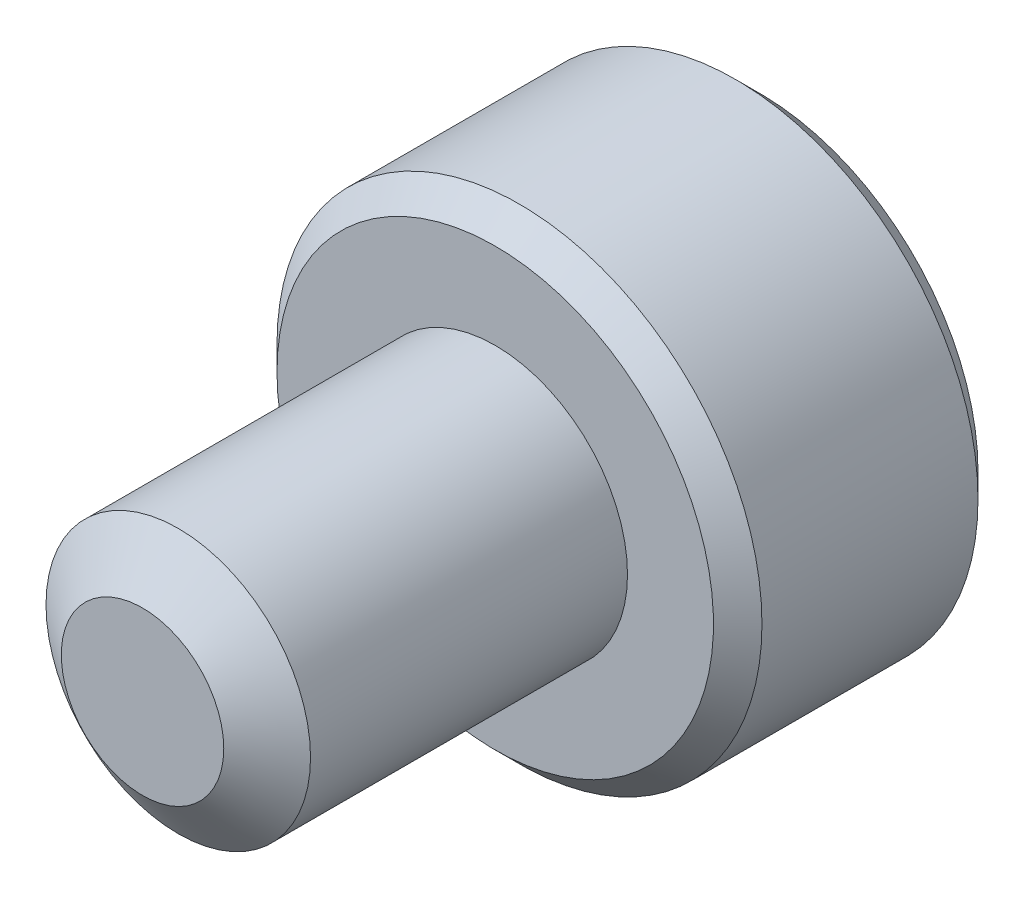
ISO-10303-21;
HEADER;
FILE_DESCRIPTION(('STEP AP214'),'2;1');
FILE_NAME('part.step','',(''),(''),'','','');
FILE_SCHEMA(('AUTOMOTIVE_DESIGN { 1 0 10303 214 1 1 1 1 }'));
ENDSEC;
DATA;
#1=APPLICATION_CONTEXT('core data for automotive mechanical design processes');
#2=APPLICATION_PROTOCOL_DEFINITION('international standard','automotive_design',2000,#1);
#3=PRODUCT_CONTEXT('',#1,'mechanical');
#4=PRODUCT('Part','Part','',(#3));
#5=PRODUCT_RELATED_PRODUCT_CATEGORY('part','',(#4));
#6=PRODUCT_DEFINITION_FORMATION('','',#4);
#7=PRODUCT_DEFINITION_CONTEXT('part definition',#1,'design');
#8=PRODUCT_DEFINITION('design','',#6,#7);
#9=PRODUCT_DEFINITION_SHAPE('','',#8);
#10=(LENGTH_UNIT() NAMED_UNIT(*) SI_UNIT(.MILLI.,.METRE.));
#11=(NAMED_UNIT(*) PLANE_ANGLE_UNIT() SI_UNIT($,.RADIAN.));
#12=(NAMED_UNIT(*) SI_UNIT($,.STERADIAN.) SOLID_ANGLE_UNIT());
#13=UNCERTAINTY_MEASURE_WITH_UNIT(LENGTH_MEASURE(1.E-05),#10,'distance_accuracy_value','');
#14=(GEOMETRIC_REPRESENTATION_CONTEXT(3) GLOBAL_UNCERTAINTY_ASSIGNED_CONTEXT((#13)) GLOBAL_UNIT_ASSIGNED_CONTEXT((#10,
#11,#12)) REPRESENTATION_CONTEXT('',''));
#15=CARTESIAN_POINT('',(0.,0.,0.));
#16=DIRECTION('',(0.,0.,1.));
#17=DIRECTION('',(1.,0.,0.));
#18=AXIS2_PLACEMENT_3D('',#15,#16,#17);
#19=CARTESIAN_POINT('',(0.,0.,-4.));
#20=DIRECTION('',(0.,0.,1.));
#21=DIRECTION('',(1.,0.,0.));
#22=AXIS2_PLACEMENT_3D('',#19,#20,#21);
#23=CYLINDRICAL_SURFACE('',#22,1.5);
#24=CARTESIAN_POINT('',(0.,0.,-4.));
#25=DIRECTION('',(0.,0.,-1.));
#26=DIRECTION('',(-1.,0.,0.));
#27=AXIS2_PLACEMENT_3D('',#24,#25,#26);
#28=CIRCLE('',#27,1.5);
#29=CARTESIAN_POINT('',(-1.5,0.,-4.));
#30=VERTEX_POINT('',#29);
#31=EDGE_CURVE('E218',#30,#30,#28,.F.);
#32=ORIENTED_EDGE('',*,*,#31,.T.);
#33=EDGE_LOOP('',(#32));
#34=FACE_BOUND('',#33,.T.);
#35=CARTESIAN_POINT('',(0.,0.,-0.40525178320938));
#36=DIRECTION('',(0.,0.,1.));
#37=DIRECTION('',(1.,0.,0.));
#38=AXIS2_PLACEMENT_3D('',#35,#36,#37);
#39=CIRCLE('',#38,1.5);
#40=CARTESIAN_POINT('',(1.5,0.,-0.40525178320938));
#41=VERTEX_POINT('',#40);
#42=EDGE_CURVE('E112',#41,#41,#39,.T.);
#43=ORIENTED_EDGE('',*,*,#42,.F.);
#44=EDGE_LOOP('',(#43));
#45=FACE_BOUND('',#44,.T.);
#46=ADVANCED_FACE('F38',(#34,#45),#23,.T.);
#47=CARTESIAN_POINT('',(0.,0.,0.));
#48=DIRECTION('',(0.,0.,-1.));
#49=DIRECTION('',(-1.,0.,0.));
#50=AXIS2_PLACEMENT_3D('',#47,#48,#49);
#51=CONICAL_SURFACE('',#50,0.921240473580834,0.959931088596884);
#52=ORIENTED_EDGE('',*,*,#42,.T.);
#53=EDGE_LOOP('',(#52));
#54=FACE_BOUND('',#53,.T.);
#55=CARTESIAN_POINT('',(0.,0.,0.));
#56=DIRECTION('',(0.,0.,1.));
#57=DIRECTION('',(1.,0.,0.));
#58=AXIS2_PLACEMENT_3D('',#55,#56,#57);
#59=CIRCLE('',#58,0.921240473580834);
#60=CARTESIAN_POINT('',(0.921240473580834,0.,0.));
#61=VERTEX_POINT('',#60);
#62=EDGE_CURVE('E216',#61,#61,#59,.T.);
#63=ORIENTED_EDGE('',*,*,#62,.F.);
#64=EDGE_LOOP('',(#63));
#65=FACE_BOUND('',#64,.T.);
#66=ADVANCED_FACE('F199',(#54,#65),#51,.T.);
#67=CARTESIAN_POINT('',(0.,0.,0.));
#68=DIRECTION('',(0.,0.,1.));
#69=DIRECTION('',(1.,0.,0.));
#70=AXIS2_PLACEMENT_3D('',#67,#68,#69);
#71=PLANE('',#70);
#72=ORIENTED_EDGE('',*,*,#62,.T.);
#73=EDGE_LOOP('',(#72));
#74=FACE_BOUND('',#73,.T.);
#75=ADVANCED_FACE('F196',(#74),#71,.T.);
#76=CARTESIAN_POINT('',(0.,0.,-7.));
#77=DIRECTION('',(0.,0.,1.));
#78=DIRECTION('',(1.,0.,0.));
#79=AXIS2_PLACEMENT_3D('',#76,#77,#78);
#80=CYLINDRICAL_SURFACE('',#79,2.75);
#81=CARTESIAN_POINT('',(0.,0.,-6.725));
#82=DIRECTION('',(0.,0.,-1.));
#83=DIRECTION('',(-1.,0.,0.));
#84=AXIS2_PLACEMENT_3D('',#81,#82,#83);
#85=CIRCLE('',#84,2.75);
#86=CARTESIAN_POINT('',(2.75,0.,-6.725));
#87=VERTEX_POINT('',#86);
#88=EDGE_CURVE('E46',#87,#87,#85,.F.);
#89=ORIENTED_EDGE('',*,*,#88,.T.);
#90=EDGE_LOOP('',(#89));
#91=FACE_BOUND('',#90,.T.);
#92=CARTESIAN_POINT('',(0.,0.,-4.275));
#93=DIRECTION('',(0.,0.,-1.));
#94=DIRECTION('',(-1.,0.,0.));
#95=AXIS2_PLACEMENT_3D('',#92,#93,#94);
#96=CIRCLE('',#95,2.75);
#97=CARTESIAN_POINT('',(-2.75,0.,-4.275));
#98=VERTEX_POINT('',#97);
#99=EDGE_CURVE('E175',#98,#98,#96,.T.);
#100=ORIENTED_EDGE('',*,*,#99,.T.);
#101=EDGE_LOOP('',(#100));
#102=FACE_BOUND('',#101,.T.);
#103=ADVANCED_FACE('F180',(#91,#102),#80,.T.);
#104=CARTESIAN_POINT('',(0.,0.,-7.));
#105=DIRECTION('',(0.,0.,-1.));
#106=DIRECTION('',(-1.,0.,0.));
#107=AXIS2_PLACEMENT_3D('',#104,#105,#106);
#108=PLANE('',#107);
#109=CARTESIAN_POINT('',(0.,0.,-7.));
#110=DIRECTION('',(0.,0.,-1.));
#111=DIRECTION('',(-1.,0.,0.));
#112=AXIS2_PLACEMENT_3D('',#109,#110,#111);
#113=CIRCLE('',#112,2.475);
#114=CARTESIAN_POINT('',(2.475,0.,-7.));
#115=VERTEX_POINT('',#114);
#116=EDGE_CURVE('E111',#115,#115,#113,.T.);
#117=ORIENTED_EDGE('',*,*,#116,.T.);
#118=EDGE_LOOP('',(#117));
#119=FACE_BOUND('',#118,.T.);
#120=CARTESIAN_POINT('',(0.,0.,-7.));
#121=DIRECTION('',(0.,0.,-1.));
#122=DIRECTION('',(-1.,0.,0.));
#123=AXIS2_PLACEMENT_3D('',#120,#121,#122);
#124=CIRCLE('',#123,1.44337567297406);
#125=CARTESIAN_POINT('',(-1.25,0.721687836487031,-7.));
#126=VERTEX_POINT('',#125);
#127=CARTESIAN_POINT('',(0.,1.44337567297406,-7.));
#128=VERTEX_POINT('',#127);
#129=EDGE_CURVE('E92',#126,#128,#124,.T.);
#130=ORIENTED_EDGE('',*,*,#129,.F.);
#131=CARTESIAN_POINT('',(-1.25,-0.721687836487032,-7.));
#132=VERTEX_POINT('',#131);
#133=EDGE_CURVE('E52',#132,#126,#124,.T.);
#134=ORIENTED_EDGE('',*,*,#133,.F.);
#135=CARTESIAN_POINT('',(0.,-1.44337567297406,-7.));
#136=VERTEX_POINT('',#135);
#137=EDGE_CURVE('E277',#136,#132,#124,.T.);
#138=ORIENTED_EDGE('',*,*,#137,.F.);
#139=CARTESIAN_POINT('',(1.25,-0.721687836487032,-7.));
#140=VERTEX_POINT('',#139);
#141=EDGE_CURVE('E59',#140,#136,#124,.T.);
#142=ORIENTED_EDGE('',*,*,#141,.F.);
#143=CARTESIAN_POINT('',(1.25,0.721687836487033,-7.));
#144=VERTEX_POINT('',#143);
#145=EDGE_CURVE('E133',#144,#140,#124,.T.);
#146=ORIENTED_EDGE('',*,*,#145,.F.);
#147=EDGE_CURVE('E101',#128,#144,#124,.T.);
#148=ORIENTED_EDGE('',*,*,#147,.F.);
#149=EDGE_LOOP('',(#130,#134,#138,#142,#146,#148));
#150=FACE_BOUND('',#149,.T.);
#151=ADVANCED_FACE('F132',(#119,#150),#108,.T.);
#152=CARTESIAN_POINT('',(0.,0.,-4.));
#153=DIRECTION('',(0.,0.,-1.));
#154=DIRECTION('',(-1.,0.,0.));
#155=AXIS2_PLACEMENT_3D('',#152,#153,#154);
#156=PLANE('',#155);
#157=CARTESIAN_POINT('',(0.,0.,-4.));
#158=DIRECTION('',(0.,0.,-1.));
#159=DIRECTION('',(-1.,0.,0.));
#160=AXIS2_PLACEMENT_3D('',#157,#158,#159);
#161=CIRCLE('',#160,2.475);
#162=CARTESIAN_POINT('',(-2.475,0.,-4.));
#163=VERTEX_POINT('',#162);
#164=EDGE_CURVE('E11',#163,#163,#161,.F.);
#165=ORIENTED_EDGE('',*,*,#164,.T.);
#166=EDGE_LOOP('',(#165));
#167=FACE_BOUND('',#166,.T.);
#168=ORIENTED_EDGE('',*,*,#31,.F.);
#169=EDGE_LOOP('',(#168));
#170=FACE_BOUND('',#169,.T.);
#171=ADVANCED_FACE('F189',(#167,#170),#156,.F.);
#172=CARTESIAN_POINT('',(0.,0.,-7.));
#173=DIRECTION('',(0.,0.,-1.));
#174=DIRECTION('',(-1.,0.,0.));
#175=AXIS2_PLACEMENT_3D('',#172,#173,#174);
#176=CONICAL_SURFACE('',#175,1.44337567297406,0.78539816339745);
#177=ORIENTED_EDGE('',*,*,#147,.T.);
#178=CARTESIAN_POINT('',(-0.000199999999999818,1.4434911430279,-7.00011548390914));
#179=CARTESIAN_POINT('',(0.0427751670715868,1.41867941875065,-6.9753216680551));
#180=CARTESIAN_POINT('',(0.0864690047459481,1.39345276980743,-6.95198373441868));
#181=CARTESIAN_POINT('',(0.175565930841942,1.34201263554194,-6.90925200408454));
#182=CARTESIAN_POINT('',(0.220977498357064,1.31579425481276,-6.88988199236041));
#183=CARTESIAN_POINT('',(0.31254782093526,1.26292610442246,-6.85670048341348));
#184=CARTESIAN_POINT('',(0.358683240175886,1.23628980770471,-6.84280555905266));
#185=CARTESIAN_POINT('',(0.451970080407593,1.18243062538508,-6.82139728216064));
#186=CARTESIAN_POINT('',(0.49911864913638,1.15520938653761,-6.81386794156679));
#187=CARTESIAN_POINT('',(0.580373556887253,1.10829684367467,-6.8070744980507));
#188=CARTESIAN_POINT('',(0.614374876627942,1.08866617256958,-6.80606855910435));
#189=CARTESIAN_POINT('',(0.682317764432478,1.04943932800611,-6.80776141491132));
#190=CARTESIAN_POINT('',(0.716259317655658,1.02984316311599,-6.81046102721554));
#191=CARTESIAN_POINT('',(0.7838148564575,0.990839954603499,-6.81940893031638));
#192=CARTESIAN_POINT('',(0.817428507286775,0.971433104248771,-6.82566052589971));
#193=CARTESIAN_POINT('',(0.884094638217814,0.932943395609905,-6.84137568141391));
#194=CARTESIAN_POINT('',(0.917146871030296,0.9138606800983,-6.85084062008746));
#195=CARTESIAN_POINT('',(1.00179969160027,0.864986351354567,-6.87893139068759));
#196=CARTESIAN_POINT('',(1.05286649242964,0.835502920149075,-6.8996701574522));
#197=CARTESIAN_POINT('',(1.15300085411326,0.777690319475908,-6.94638713467148));
#198=CARTESIAN_POINT('',(1.20207431157827,0.749357745598416,-6.97234829594677));
#199=CARTESIAN_POINT('',(1.2502,0.721572366433194,-7.00011548390914));
#200=B_SPLINE_CURVE_WITH_KNOTS('',3,(#178,#179,#180,#181,#182,#183,#184,#185,#186,#187,#188,
#189,#190,#191,#192,#193,#194,#195,#196,#197,#198,#199),.UNSPECIFIED.,.F.,.F.,(4,2,2,2,2,2,2,2,
2,2,4),(0.,0.166533409618303,0.334037607289762,0.498880396489699,0.663307919240275,
0.780963963458827,0.898645970148454,1.01643764860773,1.1342799317155,1.32148652032141,
1.50809158792574),.UNSPECIFIED.);
#201=EDGE_CURVE('E106',#128,#144,#200,.T.);
#202=ORIENTED_EDGE('',*,*,#201,.F.);
#203=EDGE_LOOP('',(#177,#202));
#204=FACE_BOUND('',#203,.T.);
#205=ADVANCED_FACE('F107',(#204),#176,.F.);
#206=ORIENTED_EDGE('',*,*,#145,.T.);
#207=CARTESIAN_POINT('',(1.25,-1.43934010808077,-7.46298209689233));
#208=CARTESIAN_POINT('',(1.25,-1.40429313005659,-7.43652492263289));
#209=CARTESIAN_POINT('',(1.25,-1.36905087135599,-7.41032716035428));
#210=CARTESIAN_POINT('',(1.25,-1.29809650706311,-7.35855757183958));
#211=CARTESIAN_POINT('',(1.25,-1.26238428576495,-7.33298590435629));
#212=CARTESIAN_POINT('',(1.25,-1.15390111792708,-7.25700599368946));
#213=CARTESIAN_POINT('',(1.25,-1.08031646726264,-7.20774028618957));
#214=CARTESIAN_POINT('',(1.25,-0.926012322755096,-7.11102583026313));
#215=CARTESIAN_POINT('',(1.25,-0.845125318656147,-7.0638412989418));
#216=CARTESIAN_POINT('',(1.25,-0.679311174076602,-6.97753073439041));
#217=CARTESIAN_POINT('',(1.25,-0.594398891026688,-6.9383775346269));
#218=CARTESIAN_POINT('',(1.25,-0.466944812460741,-6.89047722368829));
#219=CARTESIAN_POINT('',(1.25,-0.426289985812822,-6.87672948978634));
#220=CARTESIAN_POINT('',(1.25,-0.343998850091268,-6.85249792745054));
#221=CARTESIAN_POINT('',(1.25,-0.302362473614963,-6.84201432386977));
#222=CARTESIAN_POINT('',(1.25,-0.219052696285666,-6.8250301617483));
#223=CARTESIAN_POINT('',(1.25,-0.177393428474501,-6.81846136047137));
#224=CARTESIAN_POINT('',(1.25,-0.0936293693401928,-6.80943505345776));
#225=CARTESIAN_POINT('',(1.25,-0.0515246558543966,-6.80697684099727));
#226=CARTESIAN_POINT('',(1.25,0.0311890576306311,-6.80635406201329));
#227=CARTESIAN_POINT('',(1.25,0.07179696254993,-6.80803711684625));
#228=CARTESIAN_POINT('',(1.25,0.152668636885197,-6.81526827059791));
#229=CARTESIAN_POINT('',(1.25,0.192932338835358,-6.82081711041311));
#230=CARTESIAN_POINT('',(1.25,0.273499879165295,-6.83557103646495));
#231=CARTESIAN_POINT('',(1.25,0.313792180618511,-6.84483817596411));
#232=CARTESIAN_POINT('',(1.25,0.393496413911457,-6.86653617845735));
#233=CARTESIAN_POINT('',(1.25,0.432908419115059,-6.87896677673065));
#234=CARTESIAN_POINT('',(1.25,0.556992735862298,-6.92277935293144));
#235=CARTESIAN_POINT('',(1.25,0.639898924666085,-6.95915107287596));
#236=CARTESIAN_POINT('',(1.25,0.801816555499701,-7.04001916217833));
#237=CARTESIAN_POINT('',(1.25,0.880812666325044,-7.08454472091199));
#238=CARTESIAN_POINT('',(1.25,1.0317856127975,-7.17640487666662));
#239=CARTESIAN_POINT('',(1.25,1.10391618485086,-7.22348993391625));
#240=CARTESIAN_POINT('',(1.25,1.2101860604331,-7.29627856159854));
#241=CARTESIAN_POINT('',(1.25,1.24515069969379,-7.32079808539336));
#242=CARTESIAN_POINT('',(1.25,1.31460220852736,-7.37048563676568));
#243=CARTESIAN_POINT('',(1.25,1.34908920596618,-7.39565348541552));
#244=CARTESIAN_POINT('',(1.25,1.38337731682911,-7.42109014884121));
#245=B_SPLINE_CURVE_WITH_KNOTS('',3,(#207,#208,#209,#210,#211,#212,#213,#214,#215,#216,#217,
#218,#219,#220,#221,#222,#223,#224,#225,#226,#227,#228,#229,#230,#231,#232,#233,#234,#235,#236,
#237,#238,#239,#240,#241,#242,#243,#244),.UNSPECIFIED.,.F.,.F.,(4,2,2,2,2,2,2,2,2,2,2,2,2,2,2,2,
2,2,4),(0.,0.131732960381448,0.263498984161645,0.529042014455826,0.809741926134619,
1.08947609717225,1.21811634272577,1.346765447839,1.47310084517844,1.59941451973784,
1.72115042167849,1.84290966131735,1.96679153905342,2.09066305366039,2.36146692896009,
2.63325989198491,2.89154668212279,3.01965734507713,3.14773302245628),.UNSPECIFIED.);
#246=EDGE_CURVE('E100',#144,#140,#245,.F.);
#247=ORIENTED_EDGE('',*,*,#246,.F.);
#248=EDGE_LOOP('',(#206,#247));
#249=FACE_BOUND('',#248,.T.);
#250=ADVANCED_FACE('F283',(#249),#176,.F.);
#251=ORIENTED_EDGE('',*,*,#141,.T.);
#252=CARTESIAN_POINT('',(1.2502,-0.721572366433195,-7.00011548390914));
#253=CARTESIAN_POINT('',(1.20722483292841,-0.746384090710444,-6.9753216680551));
#254=CARTESIAN_POINT('',(1.16353099525405,-0.771610739653665,-6.95198373441869));
#255=CARTESIAN_POINT('',(1.07443406915806,-0.823050873919155,-6.90925200408454));
#256=CARTESIAN_POINT('',(1.02902250164294,-0.849269254648333,-6.88988199236042));
#257=CARTESIAN_POINT('',(0.937452179064741,-0.902137405038636,-6.85670048341348));
#258=CARTESIAN_POINT('',(0.891316759824115,-0.928773701756387,-6.84280555905266));
#259=CARTESIAN_POINT('',(0.798029919592408,-0.982632884076013,-6.82139728216064));
#260=CARTESIAN_POINT('',(0.75088135086362,-1.00985412292348,-6.81386794156679));
#261=CARTESIAN_POINT('',(0.669626443112748,-1.05676666578643,-6.8070744980507));
#262=CARTESIAN_POINT('',(0.635625123372059,-1.07639733689152,-6.80606855910435));
#263=CARTESIAN_POINT('',(0.567682235567523,-1.11562418145499,-6.80776141491132));
#264=CARTESIAN_POINT('',(0.533740682344343,-1.1352203463451,-6.81046102721554));
#265=CARTESIAN_POINT('',(0.466185143542501,-1.1742235548576,-6.81940893031638));
#266=CARTESIAN_POINT('',(0.432571492713225,-1.19363040521233,-6.82566052589971));
#267=CARTESIAN_POINT('',(0.365905361782187,-1.23212011385119,-6.84137568141391));
#268=CARTESIAN_POINT('',(0.332853128969705,-1.2512028293628,-6.85084062008746));
#269=CARTESIAN_POINT('',(0.248200308399736,-1.30007715810653,-6.87893139068759));
#270=CARTESIAN_POINT('',(0.197133507570362,-1.32956058931202,-6.8996701574522));
#271=CARTESIAN_POINT('',(0.0969991458867453,-1.38737318998519,-6.94638713467148));
#272=CARTESIAN_POINT('',(0.0479256884217306,-1.41570576386268,-6.97234829594677));
#273=CARTESIAN_POINT('',(-0.000199999999999859,-1.4434911430279,-7.00011548390914));
#274=B_SPLINE_CURVE_WITH_KNOTS('',3,(#252,#253,#254,#255,#256,#257,#258,#259,#260,#261,#262,
#263,#264,#265,#266,#267,#268,#269,#270,#271,#272,#273),.UNSPECIFIED.,.F.,.F.,(4,2,2,2,2,2,2,2,
2,2,4),(0.,0.166533409618303,0.334037607289761,0.498880396489698,0.663307919240274,
0.780963963458826,0.898645970148453,1.01643764860773,1.13427993171549,1.32148652032141,
1.50809158792573),.UNSPECIFIED.);
#275=EDGE_CURVE('E143',#140,#136,#274,.T.);
#276=ORIENTED_EDGE('',*,*,#275,.F.);
#277=EDGE_LOOP('',(#251,#276));
#278=FACE_BOUND('',#277,.T.);
#279=ADVANCED_FACE('F280',(#278),#176,.F.);
#280=ORIENTED_EDGE('',*,*,#137,.T.);
#281=CARTESIAN_POINT('',(0.000200000000000015,-1.4434911430279,-7.00011548390914));
#282=CARTESIAN_POINT('',(-0.0427751670715867,-1.41867941875065,-6.9753216680551));
#283=CARTESIAN_POINT('',(-0.086469004745948,-1.39345276980743,-6.95198373441868));
#284=CARTESIAN_POINT('',(-0.175565930841942,-1.34201263554194,-6.90925200408454));
#285=CARTESIAN_POINT('',(-0.220977498357064,-1.31579425481276,-6.88988199236041));
#286=CARTESIAN_POINT('',(-0.312547820935259,-1.26292610442246,-6.85670048341348));
#287=CARTESIAN_POINT('',(-0.358683240175885,-1.23628980770471,-6.84280555905266));
#288=CARTESIAN_POINT('',(-0.451970080407592,-1.18243062538508,-6.82139728216064));
#289=CARTESIAN_POINT('',(-0.499118649136379,-1.15520938653761,-6.81386794156679));
#290=CARTESIAN_POINT('',(-0.580373556887252,-1.10829684367467,-6.8070744980507));
#291=CARTESIAN_POINT('',(-0.61437487662794,-1.08866617256958,-6.80606855910435));
#292=CARTESIAN_POINT('',(-0.682317764432477,-1.04943932800611,-6.80776141491132));
#293=CARTESIAN_POINT('',(-0.716259317655657,-1.02984316311599,-6.81046102721554));
#294=CARTESIAN_POINT('',(-0.783814856457499,-0.9908399546035,-6.81940893031638));
#295=CARTESIAN_POINT('',(-0.817428507286774,-0.971433104248772,-6.82566052589971));
#296=CARTESIAN_POINT('',(-0.884094638217813,-0.932943395609906,-6.84137568141391));
#297=CARTESIAN_POINT('',(-0.917146871030295,-0.913860680098301,-6.85084062008746));
#298=CARTESIAN_POINT('',(-1.00179969160026,-0.864986351354568,-6.87893139068759));
#299=CARTESIAN_POINT('',(-1.05286649242964,-0.835502920149076,-6.8996701574522));
#300=CARTESIAN_POINT('',(-1.15300085411326,-0.777690319475909,-6.94638713467148));
#301=CARTESIAN_POINT('',(-1.20207431157827,-0.749357745598417,-6.97234829594677));
#302=CARTESIAN_POINT('',(-1.2502,-0.721572366433195,-7.00011548390914));
#303=B_SPLINE_CURVE_WITH_KNOTS('',3,(#281,#282,#283,#284,#285,#286,#287,#288,#289,#290,#291,
#292,#293,#294,#295,#296,#297,#298,#299,#300,#301,#302),.UNSPECIFIED.,.F.,.F.,(4,2,2,2,2,2,2,2,
2,2,4),(0.,0.166533409618304,0.334037607289761,0.498880396489697,0.663307919240274,
0.780963963458826,0.898645970148452,1.01643764860773,1.13427993171549,1.32148652032141,
1.50809158792574),.UNSPECIFIED.);
#304=EDGE_CURVE('E254',#136,#132,#303,.T.);
#305=ORIENTED_EDGE('',*,*,#304,.F.);
#306=EDGE_LOOP('',(#280,#305));
#307=FACE_BOUND('',#306,.T.);
#308=ADVANCED_FACE('F279',(#307),#176,.F.);
#309=ORIENTED_EDGE('',*,*,#133,.T.);
#310=CARTESIAN_POINT('',(-1.25,-1.43934010829019,-7.46298209705044));
#311=CARTESIAN_POINT('',(-1.25,-1.40429313026013,-7.43652492278491));
#312=CARTESIAN_POINT('',(-1.25,-1.36905087155364,-7.41032716050022));
#313=CARTESIAN_POINT('',(-1.25,-1.29809650724891,-7.3585575719734));
#314=CARTESIAN_POINT('',(-1.25,-1.2623842859448,-7.33298590448407));
#315=CARTESIAN_POINT('',(-1.25,-1.1539011180887,-7.25700599379899));
#316=CARTESIAN_POINT('',(-1.25,-1.08031646741188,-7.20774028628697));
#317=CARTESIAN_POINT('',(-1.25,-0.926012322877303,-7.11102583033562));
#318=CARTESIAN_POINT('',(-1.25,-0.845125318763649,-7.06384129900157));
#319=CARTESIAN_POINT('',(-1.25,-0.679311174153444,-6.97753073442662));
#320=CARTESIAN_POINT('',(-1.25,-0.594398891087584,-6.93837753465223));
#321=CARTESIAN_POINT('',(-1.25,-0.466944812509639,-6.89047722370555));
#322=CARTESIAN_POINT('',(-1.25,-0.426289985866744,-6.87672948980391));
#323=CARTESIAN_POINT('',(-1.25,-0.343998850155403,-6.85249792746773));
#324=CARTESIAN_POINT('',(-1.25,-0.302362473684286,-6.84201432388626));
#325=CARTESIAN_POINT('',(-1.25,-0.219052696365195,-6.8250301617622));
#326=CARTESIAN_POINT('',(-1.25,-0.177393428559044,-6.81846136048343));
#327=CARTESIAN_POINT('',(-1.25,-0.0936293694345983,-6.80943505346499));
#328=CARTESIAN_POINT('',(-1.25,-0.0515246559536491,-6.80697684100152));
#329=CARTESIAN_POINT('',(-1.25,0.0311890575224384,-6.80635406201073));
#330=CARTESIAN_POINT('',(-1.25,0.0717969624376317,-6.80803711683992));
#331=CARTESIAN_POINT('',(-1.25,0.152668636765093,-6.81526827058346));
#332=CARTESIAN_POINT('',(-1.25,0.192932338711553,-6.8208171103943));
#333=CARTESIAN_POINT('',(-1.25,0.273499879034189,-6.83557103643701));
#334=CARTESIAN_POINT('',(-1.25,0.313792180483814,-6.84483817593136));
#335=CARTESIAN_POINT('',(-1.25,0.393496413769926,-6.86653617841489));
#336=CARTESIAN_POINT('',(-1.25,0.432908418970283,-6.87896677668328));
#337=CARTESIAN_POINT('',(-1.25,0.556992735685998,-6.92277935286094));
#338=CARTESIAN_POINT('',(-1.25,0.639898924463084,-6.95915107278417));
#339=CARTESIAN_POINT('',(-1.25,0.801816555245349,-7.04001916204164));
#340=CARTESIAN_POINT('',(-1.25,0.880812666046054,-7.08454472075164));
#341=CARTESIAN_POINT('',(-1.25,1.03178561247421,-7.17640487646102));
#342=CARTESIAN_POINT('',(-1.25,1.10391618450775,-7.22348993368924));
#343=CARTESIAN_POINT('',(-1.25,1.2101860600607,-7.29627856133953));
#344=CARTESIAN_POINT('',(-1.25,1.24515069931176,-7.32079808512376));
#345=CARTESIAN_POINT('',(-1.25,1.31460220812615,-7.37048563647493));
#346=CARTESIAN_POINT('',(-1.25,1.3490892055554,-7.3956534851142));
#347=CARTESIAN_POINT('',(-1.25,1.38337731640879,-7.42109014852934));
#348=B_SPLINE_CURVE_WITH_KNOTS('',3,(#310,#311,#312,#313,#314,#315,#316,#317,#318,#319,#320,
#321,#322,#323,#324,#325,#326,#327,#328,#329,#330,#331,#332,#333,#334,#335,#336,#337,#338,#339,
#340,#341,#342,#343,#344,#345,#346,#347),.UNSPECIFIED.,.F.,.F.,(4,2,2,2,2,2,2,2,2,2,2,2,2,2,2,2,
2,2,4),(0.,0.131732960406522,0.2634989842118,0.52904201455708,0.809741926293177,
1.08947609738757,1.21811634292656,1.34676544802529,1.47310084535082,1.59941451989631,
1.72115042182424,1.84290966145034,1.96679153917269,2.09066305376595,2.36146692896707,
2.63325989189267,2.89154668194565,3.01965734485811,3.1477330221954),.UNSPECIFIED.);
#349=EDGE_CURVE('E122',#132,#126,#348,.T.);
#350=ORIENTED_EDGE('',*,*,#349,.F.);
#351=EDGE_LOOP('',(#309,#350));
#352=FACE_BOUND('',#351,.T.);
#353=ADVANCED_FACE('F292',(#352),#176,.F.);
#354=ORIENTED_EDGE('',*,*,#129,.T.);
#355=CARTESIAN_POINT('',(-1.2502,0.721572366433194,-7.00011548390914));
#356=CARTESIAN_POINT('',(-1.20722483292841,0.746384090710444,-6.9753216680551));
#357=CARTESIAN_POINT('',(-1.16353099525405,0.771610739653664,-6.95198373441868));
#358=CARTESIAN_POINT('',(-1.07443406915806,0.823050873919154,-6.90925200408454));
#359=CARTESIAN_POINT('',(-1.02902250164294,0.849269254648333,-6.88988199236041));
#360=CARTESIAN_POINT('',(-0.93745217906474,0.902137405038635,-6.85670048341348));
#361=CARTESIAN_POINT('',(-0.891316759824115,0.928773701756387,-6.84280555905266));
#362=CARTESIAN_POINT('',(-0.798029919592408,0.982632884076012,-6.82139728216064));
#363=CARTESIAN_POINT('',(-0.75088135086362,1.00985412292348,-6.81386794156679));
#364=CARTESIAN_POINT('',(-0.669626443112748,1.05676666578643,-6.8070744980507));
#365=CARTESIAN_POINT('',(-0.635625123372059,1.07639733689152,-6.80606855910435));
#366=CARTESIAN_POINT('',(-0.567682235567523,1.11562418145499,-6.80776141491132));
#367=CARTESIAN_POINT('',(-0.533740682344343,1.1352203463451,-6.81046102721554));
#368=CARTESIAN_POINT('',(-0.466185143542501,1.1742235548576,-6.81940893031638));
#369=CARTESIAN_POINT('',(-0.432571492713225,1.19363040521233,-6.82566052589971));
#370=CARTESIAN_POINT('',(-0.365905361782187,1.23212011385119,-6.8413756814139));
#371=CARTESIAN_POINT('',(-0.332853128969705,1.2512028293628,-6.85084062008746));
#372=CARTESIAN_POINT('',(-0.248200308399736,1.30007715810653,-6.87893139068759));
#373=CARTESIAN_POINT('',(-0.197133507570362,1.32956058931202,-6.8996701574522));
#374=CARTESIAN_POINT('',(-0.096999145886745,1.38737318998519,-6.94638713467148));
#375=CARTESIAN_POINT('',(-0.0479256884217303,1.41570576386268,-6.97234829594677));
#376=CARTESIAN_POINT('',(0.000200000000000535,1.4434911430279,-7.00011548390914));
#377=B_SPLINE_CURVE_WITH_KNOTS('',3,(#355,#356,#357,#358,#359,#360,#361,#362,#363,#364,#365,
#366,#367,#368,#369,#370,#371,#372,#373,#374,#375,#376),.UNSPECIFIED.,.F.,.F.,(4,2,2,2,2,2,2,2,
2,2,4),(0.,0.166533409618304,0.334037607289762,0.498880396489699,0.663307919240275,
0.780963963458827,0.898645970148453,1.01643764860773,1.1342799317155,1.32148652032141,
1.50809158792574),.UNSPECIFIED.);
#378=EDGE_CURVE('E96',#126,#128,#377,.T.);
#379=ORIENTED_EDGE('',*,*,#378,.F.);
#380=EDGE_LOOP('',(#354,#379));
#381=FACE_BOUND('',#380,.T.);
#382=ADVANCED_FACE('F94',(#381),#176,.F.);
#383=CARTESIAN_POINT('',(1.25,2.1650635094611,-5.125));
#384=DIRECTION('',(0.,0.,-1.));
#385=DIRECTION('',(-1.,0.,0.));
#386=AXIS2_PLACEMENT_3D('',#383,#384,#385);
#387=PLANE('',#386);
#388=DIRECTION('',(0.866025403784439,0.5,0.));
#389=VECTOR('',#388,1.);
#390=CARTESIAN_POINT('',(-1.25,0.721687836487032,-5.125));
#391=LINE('',#390,#389);
#392=CARTESIAN_POINT('',(-1.25,0.721687836487032,-5.125));
#393=VERTEX_POINT('',#392);
#394=CARTESIAN_POINT('',(0.,1.44337567297406,-5.125));
#395=VERTEX_POINT('',#394);
#396=EDGE_CURVE('E121',#393,#395,#391,.T.);
#397=ORIENTED_EDGE('',*,*,#396,.T.);
#398=DIRECTION('',(0.866025403784439,-0.5,0.));
#399=VECTOR('',#398,1.);
#400=CARTESIAN_POINT('',(0.,1.44337567297406,-5.125));
#401=LINE('',#400,#399);
#402=CARTESIAN_POINT('',(1.25,0.721687836487032,-5.125));
#403=VERTEX_POINT('',#402);
#404=EDGE_CURVE('E126',#395,#403,#401,.T.);
#405=ORIENTED_EDGE('',*,*,#404,.T.);
#406=DIRECTION('',(0.,-1.,0.));
#407=VECTOR('',#406,1.);
#408=CARTESIAN_POINT('',(1.25,0.721687836487032,-5.125));
#409=LINE('',#408,#407);
#410=CARTESIAN_POINT('',(1.25,-0.721687836487033,-5.125));
#411=VERTEX_POINT('',#410);
#412=EDGE_CURVE('E240',#403,#411,#409,.T.);
#413=ORIENTED_EDGE('',*,*,#412,.T.);
#414=DIRECTION('',(-0.866025403784439,-0.5,0.));
#415=VECTOR('',#414,1.);
#416=CARTESIAN_POINT('',(1.25,-0.721687836487033,-5.125));
#417=LINE('',#416,#415);
#418=CARTESIAN_POINT('',(0.,-1.44337567297406,-5.125));
#419=VERTEX_POINT('',#418);
#420=EDGE_CURVE('E237',#411,#419,#417,.T.);
#421=ORIENTED_EDGE('',*,*,#420,.T.);
#422=DIRECTION('',(-0.866025403784439,0.5,0.));
#423=VECTOR('',#422,1.);
#424=CARTESIAN_POINT('',(0.,-1.44337567297406,-5.125));
#425=LINE('',#424,#423);
#426=CARTESIAN_POINT('',(-1.25,-0.721687836487032,-5.125));
#427=VERTEX_POINT('',#426);
#428=EDGE_CURVE('E234',#419,#427,#425,.T.);
#429=ORIENTED_EDGE('',*,*,#428,.T.);
#430=DIRECTION('',(0.,1.,0.));
#431=VECTOR('',#430,1.);
#432=CARTESIAN_POINT('',(-1.25,-0.721687836487032,-5.125));
#433=LINE('',#432,#431);
#434=EDGE_CURVE('E129',#427,#393,#433,.T.);
#435=ORIENTED_EDGE('',*,*,#434,.T.);
#436=EDGE_LOOP('',(#397,#405,#413,#421,#429,#435));
#437=FACE_BOUND('',#436,.T.);
#438=ADVANCED_FACE('F163',(#437),#387,.T.);
#439=CARTESIAN_POINT('',(0.,1.44337567297406,-5.125));
#440=DIRECTION('',(0.5,0.866025403784439,0.));
#441=DIRECTION('',(-0.866025403784439,0.5,0.));
#442=AXIS2_PLACEMENT_3D('',#439,#440,#441);
#443=PLANE('',#442);
#444=DIRECTION('',(0.,0.,-1.));
#445=VECTOR('',#444,1.);
#446=CARTESIAN_POINT('',(0.,1.44337567297406,-5.125));
#447=LINE('',#446,#445);
#448=EDGE_CURVE('E118',#395,#128,#447,.T.);
#449=ORIENTED_EDGE('',*,*,#448,.T.);
#450=ORIENTED_EDGE('',*,*,#201,.T.);
#451=DIRECTION('',(0.,0.,-1.));
#452=VECTOR('',#451,1.);
#453=CARTESIAN_POINT('',(1.25,0.721687836487032,-5.125));
#454=LINE('',#453,#452);
#455=EDGE_CURVE('E128',#403,#144,#454,.T.);
#456=ORIENTED_EDGE('',*,*,#455,.F.);
#457=ORIENTED_EDGE('',*,*,#404,.F.);
#458=EDGE_LOOP('',(#449,#450,#456,#457));
#459=FACE_BOUND('',#458,.T.);
#460=ADVANCED_FACE('F124',(#459),#443,.F.);
#461=CARTESIAN_POINT('',(1.25,0.721687836487032,-5.125));
#462=DIRECTION('',(1.,0.,0.));
#463=DIRECTION('',(0.,0.,-1.));
#464=AXIS2_PLACEMENT_3D('',#461,#462,#463);
#465=PLANE('',#464);
#466=ORIENTED_EDGE('',*,*,#455,.T.);
#467=ORIENTED_EDGE('',*,*,#246,.T.);
#468=DIRECTION('',(0.,0.,-1.));
#469=VECTOR('',#468,1.);
#470=CARTESIAN_POINT('',(1.25,-0.721687836487033,-5.125));
#471=LINE('',#470,#469);
#472=EDGE_CURVE('E223',#411,#140,#471,.T.);
#473=ORIENTED_EDGE('',*,*,#472,.F.);
#474=ORIENTED_EDGE('',*,*,#412,.F.);
#475=EDGE_LOOP('',(#466,#467,#473,#474));
#476=FACE_BOUND('',#475,.T.);
#477=ADVANCED_FACE('F152',(#476),#465,.F.);
#478=CARTESIAN_POINT('',(1.25,-0.721687836487033,-5.125));
#479=DIRECTION('',(0.5,-0.866025403784439,0.));
#480=DIRECTION('',(0.866025403784439,0.5,0.));
#481=AXIS2_PLACEMENT_3D('',#478,#479,#480);
#482=PLANE('',#481);
#483=ORIENTED_EDGE('',*,*,#472,.T.);
#484=ORIENTED_EDGE('',*,*,#275,.T.);
#485=DIRECTION('',(0.,0.,-1.));
#486=VECTOR('',#485,1.);
#487=CARTESIAN_POINT('',(0.,-1.44337567297406,-5.125));
#488=LINE('',#487,#486);
#489=EDGE_CURVE('E226',#419,#136,#488,.T.);
#490=ORIENTED_EDGE('',*,*,#489,.F.);
#491=ORIENTED_EDGE('',*,*,#420,.F.);
#492=EDGE_LOOP('',(#483,#484,#490,#491));
#493=FACE_BOUND('',#492,.T.);
#494=ADVANCED_FACE('F156',(#493),#482,.F.);
#495=CARTESIAN_POINT('',(0.,-1.44337567297406,-5.125));
#496=DIRECTION('',(-0.5,-0.866025403784439,0.));
#497=DIRECTION('',(0.866025403784439,-0.5,0.));
#498=AXIS2_PLACEMENT_3D('',#495,#496,#497);
#499=PLANE('',#498);
#500=ORIENTED_EDGE('',*,*,#489,.T.);
#501=ORIENTED_EDGE('',*,*,#304,.T.);
#502=DIRECTION('',(0.,0.,-1.));
#503=VECTOR('',#502,1.);
#504=CARTESIAN_POINT('',(-1.25,-0.721687836487032,-5.125));
#505=LINE('',#504,#503);
#506=EDGE_CURVE('E229',#427,#132,#505,.T.);
#507=ORIENTED_EDGE('',*,*,#506,.F.);
#508=ORIENTED_EDGE('',*,*,#428,.F.);
#509=EDGE_LOOP('',(#500,#501,#507,#508));
#510=FACE_BOUND('',#509,.T.);
#511=ADVANCED_FACE('F262',(#510),#499,.F.);
#512=CARTESIAN_POINT('',(-1.25,-0.721687836487032,-5.125));
#513=DIRECTION('',(-1.,0.,0.));
#514=DIRECTION('',(0.,-1.,0.));
#515=AXIS2_PLACEMENT_3D('',#512,#513,#514);
#516=PLANE('',#515);
#517=ORIENTED_EDGE('',*,*,#506,.T.);
#518=ORIENTED_EDGE('',*,*,#349,.T.);
#519=DIRECTION('',(0.,0.,-1.));
#520=VECTOR('',#519,1.);
#521=CARTESIAN_POINT('',(-1.25,0.721687836487032,-5.125));
#522=LINE('',#521,#520);
#523=EDGE_CURVE('E120',#393,#126,#522,.T.);
#524=ORIENTED_EDGE('',*,*,#523,.F.);
#525=ORIENTED_EDGE('',*,*,#434,.F.);
#526=EDGE_LOOP('',(#517,#518,#524,#525));
#527=FACE_BOUND('',#526,.T.);
#528=ADVANCED_FACE('F259',(#527),#516,.F.);
#529=CARTESIAN_POINT('',(-1.25,0.721687836487032,-5.125));
#530=DIRECTION('',(-0.5,0.866025403784439,0.));
#531=DIRECTION('',(-0.866025403784439,-0.5,0.));
#532=AXIS2_PLACEMENT_3D('',#529,#530,#531);
#533=PLANE('',#532);
#534=ORIENTED_EDGE('',*,*,#523,.T.);
#535=ORIENTED_EDGE('',*,*,#378,.T.);
#536=ORIENTED_EDGE('',*,*,#448,.F.);
#537=ORIENTED_EDGE('',*,*,#396,.F.);
#538=EDGE_LOOP('',(#534,#535,#536,#537));
#539=FACE_BOUND('',#538,.T.);
#540=ADVANCED_FACE('F116',(#539),#533,.F.);
#541=CARTESIAN_POINT('',(0.,0.,-7.));
#542=DIRECTION('',(0.,0.,1.));
#543=DIRECTION('',(1.,0.,0.));
#544=AXIS2_PLACEMENT_3D('',#541,#542,#543);
#545=CONICAL_SURFACE('',#544,2.475,0.785398163397447);
#546=CARTESIAN_POINT('',(2.75,0.,-6.725));
#547=CARTESIAN_POINT('',(2.74713541666667,0.,-6.72786458333333));
#548=CARTESIAN_POINT('',(2.74427083333333,0.,-6.73072916666667));
#549=CARTESIAN_POINT('',(2.73854166666667,0.,-6.73645833333333));
#550=CARTESIAN_POINT('',(2.73567708333333,0.,-6.73932291666667));
#551=CARTESIAN_POINT('',(2.72994791666667,0.,-6.74505208333333));
#552=CARTESIAN_POINT('',(2.72708333333333,0.,-6.74791666666667));
#553=CARTESIAN_POINT('',(2.72135416666667,0.,-6.75364583333333));
#554=CARTESIAN_POINT('',(2.71848958333333,0.,-6.75651041666667));
#555=CARTESIAN_POINT('',(2.71276041666667,0.,-6.76223958333333));
#556=CARTESIAN_POINT('',(2.70989583333333,0.,-6.76510416666667));
#557=CARTESIAN_POINT('',(2.70416666666667,0.,-6.77083333333333));
#558=CARTESIAN_POINT('',(2.70130208333333,0.,-6.77369791666667));
#559=CARTESIAN_POINT('',(2.69557291666667,0.,-6.77942708333333));
#560=CARTESIAN_POINT('',(2.69270833333333,0.,-6.78229166666667));
#561=CARTESIAN_POINT('',(2.68697916666667,0.,-6.78802083333333));
#562=CARTESIAN_POINT('',(2.68411458333333,0.,-6.79088541666667));
#563=CARTESIAN_POINT('',(2.67838541666667,0.,-6.79661458333333));
#564=CARTESIAN_POINT('',(2.67552083333333,0.,-6.79947916666667));
#565=CARTESIAN_POINT('',(2.66979166666667,0.,-6.80520833333333));
#566=CARTESIAN_POINT('',(2.66692708333333,0.,-6.80807291666667));
#567=CARTESIAN_POINT('',(2.66119791666667,0.,-6.81380208333333));
#568=CARTESIAN_POINT('',(2.65833333333333,0.,-6.81666666666667));
#569=CARTESIAN_POINT('',(2.65260416666667,0.,-6.82239583333333));
#570=CARTESIAN_POINT('',(2.64973958333333,0.,-6.82526041666667));
#571=CARTESIAN_POINT('',(2.64401041666667,0.,-6.83098958333333));
#572=CARTESIAN_POINT('',(2.64114583333333,0.,-6.83385416666667));
#573=CARTESIAN_POINT('',(2.63541666666667,0.,-6.83958333333333));
#574=CARTESIAN_POINT('',(2.63255208333333,0.,-6.84244791666667));
#575=CARTESIAN_POINT('',(2.62682291666667,0.,-6.84817708333333));
#576=CARTESIAN_POINT('',(2.62395833333333,0.,-6.85104166666667));
#577=CARTESIAN_POINT('',(2.61822916666667,0.,-6.85677083333333));
#578=CARTESIAN_POINT('',(2.61536458333333,0.,-6.85963541666667));
#579=CARTESIAN_POINT('',(2.60963541666667,0.,-6.86536458333333));
#580=CARTESIAN_POINT('',(2.60677083333333,0.,-6.86822916666667));
#581=CARTESIAN_POINT('',(2.60104166666667,0.,-6.87395833333333));
#582=CARTESIAN_POINT('',(2.59817708333333,0.,-6.87682291666667));
#583=CARTESIAN_POINT('',(2.59244791666667,0.,-6.88255208333333));
#584=CARTESIAN_POINT('',(2.58958333333333,0.,-6.88541666666667));
#585=CARTESIAN_POINT('',(2.58385416666667,0.,-6.89114583333333));
#586=CARTESIAN_POINT('',(2.58098958333333,0.,-6.89401041666667));
#587=CARTESIAN_POINT('',(2.57526041666667,0.,-6.89973958333333));
#588=CARTESIAN_POINT('',(2.57239583333333,0.,-6.90260416666667));
#589=CARTESIAN_POINT('',(2.56666666666667,0.,-6.90833333333333));
#590=CARTESIAN_POINT('',(2.56380208333333,0.,-6.91119791666667));
#591=CARTESIAN_POINT('',(2.55807291666667,0.,-6.91692708333333));
#592=CARTESIAN_POINT('',(2.55520833333333,0.,-6.91979166666667));
#593=CARTESIAN_POINT('',(2.54947916666667,0.,-6.92552083333333));
#594=CARTESIAN_POINT('',(2.54661458333333,0.,-6.92838541666667));
#595=CARTESIAN_POINT('',(2.54088541666667,0.,-6.93411458333333));
#596=CARTESIAN_POINT('',(2.53802083333333,0.,-6.93697916666667));
#597=CARTESIAN_POINT('',(2.53229166666667,0.,-6.94270833333333));
#598=CARTESIAN_POINT('',(2.52942708333333,0.,-6.94557291666667));
#599=CARTESIAN_POINT('',(2.52369791666667,0.,-6.95130208333333));
#600=CARTESIAN_POINT('',(2.52083333333333,0.,-6.95416666666667));
#601=CARTESIAN_POINT('',(2.51510416666667,0.,-6.95989583333333));
#602=CARTESIAN_POINT('',(2.51223958333333,0.,-6.96276041666667));
#603=CARTESIAN_POINT('',(2.50651041666667,0.,-6.96848958333333));
#604=CARTESIAN_POINT('',(2.50364583333333,0.,-6.97135416666667));
#605=CARTESIAN_POINT('',(2.49791666666667,0.,-6.97708333333333));
#606=CARTESIAN_POINT('',(2.49505208333333,0.,-6.97994791666667));
#607=CARTESIAN_POINT('',(2.48932291666667,0.,-6.98567708333333));
#608=CARTESIAN_POINT('',(2.48645833333333,0.,-6.98854166666667));
#609=CARTESIAN_POINT('',(2.48072916666667,0.,-6.99427083333333));
#610=CARTESIAN_POINT('',(2.47786458333333,0.,-6.99713541666667));
#611=CARTESIAN_POINT('',(2.475,0.,-7.));
#612=B_SPLINE_CURVE_WITH_KNOTS('',3,(#546,#547,#548,#549,#550,#551,#552,#553,#554,#555,#556,
#557,#558,#559,#560,#561,#562,#563,#564,#565,#566,#567,#568,#569,#570,#571,#572,#573,#574,#575,
#576,#577,#578,#579,#580,#581,#582,#583,#584,#585,#586,#587,#588,#589,#590,#591,#592,#593,#594,
#595,#596,#597,#598,#599,#600,#601,#602,#603,#604,#605,#606,#607,#608,#609,#610,#611),
.UNSPECIFIED.,.F.,.F.,(4,2,2,2,2,2,2,2,2,2,2,2,2,2,2,2,2,2,2,2,2,2,2,2,2,2,2,2,2,2,2,2,4),(0.,
0.0121533978016437,0.0243067956032873,0.0364601934049313,0.048613591206575,0.0607669890082187,
0.0729203868098623,0.085073784611506,0.0972271824131503,0.109380580214794,0.121533978016438,
0.133687375818082,0.145840773619725,0.157994171421369,0.170147569223013,0.182300967024657,
0.194454364826301,0.206607762627945,0.218761160429588,0.230914558231232,0.243067956032876,
0.25522135383452,0.267374751636163,0.279528149437807,0.291681547239451,0.303834945041095,
0.315988342842739,0.328141740644383,0.340295138446026,0.35244853624767,0.364601934049314,
0.376755331850957,0.388908729652602),.UNSPECIFIED.);
#613=EDGE_CURVE('BSEAM183',#87,#115,#612,.T.);
#614=ORIENTED_EDGE('',*,*,#88,.F.);
#615=ORIENTED_EDGE('',*,*,#116,.F.);
#616=ORIENTED_EDGE('',*,*,#613,.T.);
#617=ORIENTED_EDGE('',*,*,#613,.F.);
#618=EDGE_LOOP('',(#614,#616,#615,#617));
#619=FACE_BOUND('',#618,.T.);
#620=ADVANCED_FACE('F183',(#619),#545,.T.);
#621=CARTESIAN_POINT('',(0.,0.,-4.275));
#622=DIRECTION('',(0.,0.,-1.));
#623=DIRECTION('',(-1.,0.,0.));
#624=AXIS2_PLACEMENT_3D('',#621,#622,#623);
#625=CONICAL_SURFACE('',#624,2.75,0.78539816339745);
#626=ORIENTED_EDGE('',*,*,#164,.F.);
#627=EDGE_LOOP('',(#626));
#628=FACE_BOUND('',#627,.T.);
#629=ORIENTED_EDGE('',*,*,#99,.F.);
#630=EDGE_LOOP('',(#629));
#631=FACE_BOUND('',#630,.T.);
#632=ADVANCED_FACE('F40',(#628,#631),#625,.T.);
#633=CLOSED_SHELL('',(#46,#66,#75,#103,#151,#171,#205,#250,#279,#308,#353,#382,#438,#460,#477,
#494,#511,#528,#540,#620,#632));
#634=MANIFOLD_SOLID_BREP('B2',#633);
#635=ADVANCED_BREP_SHAPE_REPRESENTATION('',(#18,#634),#14);
#636=SHAPE_DEFINITION_REPRESENTATION(#9,#635);
ENDSEC;
END-ISO-10303-21;
